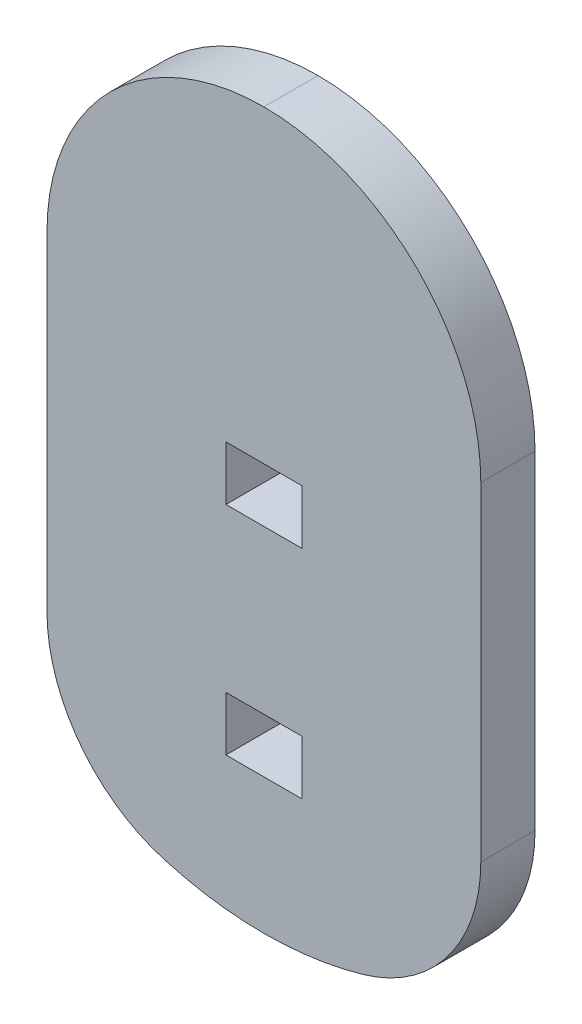
ISO-10303-21;
HEADER;
FILE_DESCRIPTION(('STEP AP214'),'2;1');
FILE_NAME('part.step','',(''),(''),'','','');
FILE_SCHEMA(('AUTOMOTIVE_DESIGN { 1 0 10303 214 1 1 1 1 }'));
ENDSEC;
DATA;
#1=APPLICATION_CONTEXT('core data for automotive mechanical design processes');
#2=APPLICATION_PROTOCOL_DEFINITION('international standard','automotive_design',2000,#1);
#3=PRODUCT_CONTEXT('',#1,'mechanical');
#4=PRODUCT('Part','Part','',(#3));
#5=PRODUCT_RELATED_PRODUCT_CATEGORY('part','',(#4));
#6=PRODUCT_DEFINITION_FORMATION('','',#4);
#7=PRODUCT_DEFINITION_CONTEXT('part definition',#1,'design');
#8=PRODUCT_DEFINITION('design','',#6,#7);
#9=PRODUCT_DEFINITION_SHAPE('','',#8);
#10=(LENGTH_UNIT() NAMED_UNIT(*) SI_UNIT(.MILLI.,.METRE.));
#11=(NAMED_UNIT(*) PLANE_ANGLE_UNIT() SI_UNIT($,.RADIAN.));
#12=(NAMED_UNIT(*) SI_UNIT($,.STERADIAN.) SOLID_ANGLE_UNIT());
#13=UNCERTAINTY_MEASURE_WITH_UNIT(LENGTH_MEASURE(1.E-05),#10,'distance_accuracy_value','');
#14=(GEOMETRIC_REPRESENTATION_CONTEXT(3) GLOBAL_UNCERTAINTY_ASSIGNED_CONTEXT((#13)) GLOBAL_UNIT_ASSIGNED_CONTEXT((#10,
#11,#12)) REPRESENTATION_CONTEXT('',''));
#15=CARTESIAN_POINT('',(0.,0.,0.));
#16=DIRECTION('',(0.,0.,1.));
#17=DIRECTION('',(1.,0.,0.));
#18=AXIS2_PLACEMENT_3D('',#15,#16,#17);
#19=CARTESIAN_POINT('',(0.,0.,5.));
#20=DIRECTION('',(0.,0.,-1.));
#21=DIRECTION('',(-1.,0.,0.));
#22=AXIS2_PLACEMENT_3D('',#19,#20,#21);
#23=CYLINDRICAL_SURFACE('',#22,33.);
#24=CARTESIAN_POINT('',(0.,0.,0.));
#25=DIRECTION('',(0.,0.,1.));
#26=DIRECTION('',(1.,0.,0.));
#27=AXIS2_PLACEMENT_3D('',#24,#25,#26);
#28=CIRCLE('',#27,33.);
#29=CARTESIAN_POINT('',(-9.16666666666666,-31.7012968539494,0.));
#30=VERTEX_POINT('',#29);
#31=CARTESIAN_POINT('',(9.16666666666668,-31.7012968539494,0.));
#32=VERTEX_POINT('',#31);
#33=EDGE_CURVE('E195',#30,#32,#28,.T.);
#34=ORIENTED_EDGE('',*,*,#33,.T.);
#35=DIRECTION('',(0.,0.,-1.));
#36=VECTOR('',#35,1.);
#37=CARTESIAN_POINT('',(9.16666666666668,-31.7012968539494,5.));
#38=LINE('',#37,#36);
#39=CARTESIAN_POINT('',(9.16666666666668,-31.7012968539494,5.));
#40=VERTEX_POINT('',#39);
#41=EDGE_CURVE('E227',#32,#40,#38,.F.);
#42=ORIENTED_EDGE('',*,*,#41,.T.);
#43=CARTESIAN_POINT('',(0.,0.,5.));
#44=DIRECTION('',(0.,0.,1.));
#45=DIRECTION('',(1.,0.,0.));
#46=AXIS2_PLACEMENT_3D('',#43,#44,#45);
#47=CIRCLE('',#46,33.);
#48=CARTESIAN_POINT('',(-9.16666666666666,-31.7012968539494,5.));
#49=VERTEX_POINT('',#48);
#50=EDGE_CURVE('E199',#49,#40,#47,.T.);
#51=ORIENTED_EDGE('',*,*,#50,.F.);
#52=DIRECTION('',(0.,0.,-1.));
#53=VECTOR('',#52,1.);
#54=CARTESIAN_POINT('',(-9.16666666666666,-31.7012968539494,5.));
#55=LINE('',#54,#53);
#56=EDGE_CURVE('E223',#49,#30,#55,.T.);
#57=ORIENTED_EDGE('',*,*,#56,.T.);
#58=EDGE_LOOP('',(#34,#42,#51,#57));
#59=FACE_BOUND('',#58,.T.);
#60=ADVANCED_FACE('F34',(#59),#23,.T.);
#61=CARTESIAN_POINT('',(0.,0.,5.));
#62=DIRECTION('',(0.,0.,1.));
#63=DIRECTION('',(1.,0.,0.));
#64=AXIS2_PLACEMENT_3D('',#61,#62,#63);
#65=PLANE('',#64);
#66=DIRECTION('',(0.,-1.,0.));
#67=VECTOR('',#66,1.);
#68=CARTESIAN_POINT('',(-3.5,4.5,5.));
#69=LINE('',#68,#67);
#70=CARTESIAN_POINT('',(-3.5,4.5,5.));
#71=VERTEX_POINT('',#70);
#72=CARTESIAN_POINT('',(-3.5,-0.5,5.));
#73=VERTEX_POINT('',#72);
#74=EDGE_CURVE('E49',#71,#73,#69,.T.);
#75=ORIENTED_EDGE('',*,*,#74,.F.);
#76=DIRECTION('',(-1.,0.,0.));
#77=VECTOR('',#76,1.);
#78=CARTESIAN_POINT('',(-3.5,4.5,5.));
#79=LINE('',#78,#77);
#80=CARTESIAN_POINT('',(3.5,4.5,5.));
#81=VERTEX_POINT('',#80);
#82=EDGE_CURVE('E165',#81,#71,#79,.T.);
#83=ORIENTED_EDGE('',*,*,#82,.F.);
#84=DIRECTION('',(0.,1.,0.));
#85=VECTOR('',#84,1.);
#86=CARTESIAN_POINT('',(3.5,4.5,5.));
#87=LINE('',#86,#85);
#88=CARTESIAN_POINT('',(3.5,-0.5,5.));
#89=VERTEX_POINT('',#88);
#90=EDGE_CURVE('E148',#89,#81,#87,.T.);
#91=ORIENTED_EDGE('',*,*,#90,.F.);
#92=DIRECTION('',(1.,0.,0.));
#93=VECTOR('',#92,1.);
#94=CARTESIAN_POINT('',(-3.5,-0.5,5.));
#95=LINE('',#94,#93);
#96=EDGE_CURVE('E158',#73,#89,#95,.T.);
#97=ORIENTED_EDGE('',*,*,#96,.F.);
#98=EDGE_LOOP('',(#75,#83,#91,#97));
#99=FACE_BOUND('',#98,.T.);
#100=DIRECTION('',(0.,-1.,0.));
#101=VECTOR('',#100,1.);
#102=CARTESIAN_POINT('',(-3.5,-15.5,5.));
#103=LINE('',#102,#101);
#104=CARTESIAN_POINT('',(-3.5,-15.5,5.));
#105=VERTEX_POINT('',#104);
#106=CARTESIAN_POINT('',(-3.5,-20.5,5.));
#107=VERTEX_POINT('',#106);
#108=EDGE_CURVE('E57',#105,#107,#103,.T.);
#109=ORIENTED_EDGE('',*,*,#108,.F.);
#110=DIRECTION('',(-1.,0.,0.));
#111=VECTOR('',#110,1.);
#112=CARTESIAN_POINT('',(-3.5,-15.5,5.));
#113=LINE('',#112,#111);
#114=CARTESIAN_POINT('',(3.5,-15.5,5.));
#115=VERTEX_POINT('',#114);
#116=EDGE_CURVE('E182',#115,#105,#113,.T.);
#117=ORIENTED_EDGE('',*,*,#116,.F.);
#118=DIRECTION('',(0.,1.,0.));
#119=VECTOR('',#118,1.);
#120=CARTESIAN_POINT('',(3.5,-15.5,5.));
#121=LINE('',#120,#119);
#122=CARTESIAN_POINT('',(3.5,-20.5,5.));
#123=VERTEX_POINT('',#122);
#124=EDGE_CURVE('E179',#123,#115,#121,.T.);
#125=ORIENTED_EDGE('',*,*,#124,.F.);
#126=DIRECTION('',(1.,0.,0.));
#127=VECTOR('',#126,1.);
#128=CARTESIAN_POINT('',(-3.5,-20.5,5.));
#129=LINE('',#128,#127);
#130=EDGE_CURVE('E176',#107,#123,#129,.T.);
#131=ORIENTED_EDGE('',*,*,#130,.F.);
#132=EDGE_LOOP('',(#109,#117,#125,#131));
#133=FACE_BOUND('',#132,.T.);
#134=ORIENTED_EDGE('',*,*,#50,.T.);
#135=CARTESIAN_POINT('',(5.00000000000001,-17.2916164657906,5.));
#136=DIRECTION('',(0.,0.,1.));
#137=DIRECTION('',(1.,0.,0.));
#138=AXIS2_PLACEMENT_3D('',#135,#136,#137);
#139=CIRCLE('',#138,15.);
#140=CARTESIAN_POINT('',(20.,-17.2916164657906,5.));
#141=VERTEX_POINT('',#140);
#142=EDGE_CURVE('E232',#40,#141,#139,.T.);
#143=ORIENTED_EDGE('',*,*,#142,.T.);
#144=DIRECTION('',(0.,-1.,0.));
#145=VECTOR('',#144,1.);
#146=CARTESIAN_POINT('',(20.,26.2488094968134,5.));
#147=LINE('',#146,#145);
#148=CARTESIAN_POINT('',(20.,13.,5.));
#149=VERTEX_POINT('',#148);
#150=EDGE_CURVE('E196',#149,#141,#147,.T.);
#151=ORIENTED_EDGE('',*,*,#150,.F.);
#152=CARTESIAN_POINT('',(0.,13.,5.));
#153=DIRECTION('',(0.,0.,1.));
#154=DIRECTION('',(1.,0.,0.));
#155=AXIS2_PLACEMENT_3D('',#152,#153,#154);
#156=CIRCLE('',#155,20.);
#157=CARTESIAN_POINT('',(0.,33.,5.));
#158=VERTEX_POINT('',#157);
#159=EDGE_CURVE('E209',#149,#158,#156,.T.);
#160=ORIENTED_EDGE('',*,*,#159,.T.);
#161=CARTESIAN_POINT('',(0.,13.,5.));
#162=DIRECTION('',(0.,0.,1.));
#163=DIRECTION('',(1.,0.,0.));
#164=AXIS2_PLACEMENT_3D('',#161,#162,#163);
#165=CIRCLE('',#164,20.);
#166=CARTESIAN_POINT('',(-20.,13.,5.));
#167=VERTEX_POINT('',#166);
#168=EDGE_CURVE('E211',#158,#167,#165,.T.);
#169=ORIENTED_EDGE('',*,*,#168,.T.);
#170=DIRECTION('',(0.,1.,0.));
#171=VECTOR('',#170,1.);
#172=CARTESIAN_POINT('',(-20.,26.2488094968134,5.));
#173=LINE('',#172,#171);
#174=CARTESIAN_POINT('',(-20.,-17.2916164657906,5.));
#175=VERTEX_POINT('',#174);
#176=EDGE_CURVE('E193',#175,#167,#173,.T.);
#177=ORIENTED_EDGE('',*,*,#176,.F.);
#178=CARTESIAN_POINT('',(-5.,-17.2916164657906,5.));
#179=DIRECTION('',(0.,0.,1.));
#180=DIRECTION('',(1.,0.,0.));
#181=AXIS2_PLACEMENT_3D('',#178,#179,#180);
#182=CIRCLE('',#181,15.);
#183=EDGE_CURVE('E230',#175,#49,#182,.T.);
#184=ORIENTED_EDGE('',*,*,#183,.T.);
#185=EDGE_LOOP('',(#134,#143,#151,#160,#169,#177,#184));
#186=FACE_BOUND('',#185,.T.);
#187=ADVANCED_FACE('F162',(#99,#133,#186),#65,.T.);
#188=CARTESIAN_POINT('',(0.,0.,0.));
#189=DIRECTION('',(0.,0.,1.));
#190=DIRECTION('',(1.,0.,0.));
#191=AXIS2_PLACEMENT_3D('',#188,#189,#190);
#192=PLANE('',#191);
#193=DIRECTION('',(-1.,0.,0.));
#194=VECTOR('',#193,1.);
#195=CARTESIAN_POINT('',(0.,4.5,0.));
#196=LINE('',#195,#194);
#197=CARTESIAN_POINT('',(3.5,4.5,0.));
#198=VERTEX_POINT('',#197);
#199=CARTESIAN_POINT('',(-3.5,4.5,0.));
#200=VERTEX_POINT('',#199);
#201=EDGE_CURVE('E42',#198,#200,#196,.T.);
#202=ORIENTED_EDGE('',*,*,#201,.T.);
#203=DIRECTION('',(0.,-1.,0.));
#204=VECTOR('',#203,1.);
#205=CARTESIAN_POINT('',(-3.5,0.,0.));
#206=LINE('',#205,#204);
#207=CARTESIAN_POINT('',(-3.5,-0.5,0.));
#208=VERTEX_POINT('',#207);
#209=EDGE_CURVE('E11',#200,#208,#206,.T.);
#210=ORIENTED_EDGE('',*,*,#209,.T.);
#211=DIRECTION('',(1.,0.,0.));
#212=VECTOR('',#211,1.);
#213=CARTESIAN_POINT('',(0.,-0.5,0.));
#214=LINE('',#213,#212);
#215=CARTESIAN_POINT('',(3.5,-0.5,0.));
#216=VERTEX_POINT('',#215);
#217=EDGE_CURVE('E255',#208,#216,#214,.T.);
#218=ORIENTED_EDGE('',*,*,#217,.T.);
#219=DIRECTION('',(0.,1.,0.));
#220=VECTOR('',#219,1.);
#221=CARTESIAN_POINT('',(3.5,0.,0.));
#222=LINE('',#221,#220);
#223=EDGE_CURVE('E151',#216,#198,#222,.T.);
#224=ORIENTED_EDGE('',*,*,#223,.T.);
#225=EDGE_LOOP('',(#202,#210,#218,#224));
#226=FACE_BOUND('',#225,.T.);
#227=DIRECTION('',(-1.,0.,0.));
#228=VECTOR('',#227,1.);
#229=CARTESIAN_POINT('',(0.,-15.5,0.));
#230=LINE('',#229,#228);
#231=CARTESIAN_POINT('',(3.5,-15.5,0.));
#232=VERTEX_POINT('',#231);
#233=CARTESIAN_POINT('',(-3.5,-15.5,0.));
#234=VERTEX_POINT('',#233);
#235=EDGE_CURVE('E249',#232,#234,#230,.T.);
#236=ORIENTED_EDGE('',*,*,#235,.T.);
#237=DIRECTION('',(0.,-1.,0.));
#238=VECTOR('',#237,1.);
#239=CARTESIAN_POINT('',(-3.5,0.,0.));
#240=LINE('',#239,#238);
#241=CARTESIAN_POINT('',(-3.5,-20.5,0.));
#242=VERTEX_POINT('',#241);
#243=EDGE_CURVE('E252',#234,#242,#240,.T.);
#244=ORIENTED_EDGE('',*,*,#243,.T.);
#245=DIRECTION('',(1.,0.,0.));
#246=VECTOR('',#245,1.);
#247=CARTESIAN_POINT('',(0.,-20.5,0.));
#248=LINE('',#247,#246);
#249=CARTESIAN_POINT('',(3.5,-20.5,0.));
#250=VERTEX_POINT('',#249);
#251=EDGE_CURVE('E243',#242,#250,#248,.T.);
#252=ORIENTED_EDGE('',*,*,#251,.T.);
#253=DIRECTION('',(0.,1.,0.));
#254=VECTOR('',#253,1.);
#255=CARTESIAN_POINT('',(3.5,0.,0.));
#256=LINE('',#255,#254);
#257=EDGE_CURVE('E246',#250,#232,#256,.T.);
#258=ORIENTED_EDGE('',*,*,#257,.T.);
#259=EDGE_LOOP('',(#236,#244,#252,#258));
#260=FACE_BOUND('',#259,.T.);
#261=DIRECTION('',(0.,-1.,0.));
#262=VECTOR('',#261,1.);
#263=CARTESIAN_POINT('',(20.,0.,0.));
#264=LINE('',#263,#262);
#265=CARTESIAN_POINT('',(20.,13.,0.));
#266=VERTEX_POINT('',#265);
#267=CARTESIAN_POINT('',(20.,-17.2916164657906,0.));
#268=VERTEX_POINT('',#267);
#269=EDGE_CURVE('E202',#266,#268,#264,.T.);
#270=ORIENTED_EDGE('',*,*,#269,.T.);
#271=CARTESIAN_POINT('',(5.00000000000001,-17.2916164657906,0.));
#272=DIRECTION('',(0.,0.,1.));
#273=DIRECTION('',(1.,0.,0.));
#274=AXIS2_PLACEMENT_3D('',#271,#272,#273);
#275=CIRCLE('',#274,15.);
#276=EDGE_CURVE('E238',#268,#32,#275,.F.);
#277=ORIENTED_EDGE('',*,*,#276,.T.);
#278=ORIENTED_EDGE('',*,*,#33,.F.);
#279=CARTESIAN_POINT('',(-5.,-17.2916164657906,0.));
#280=DIRECTION('',(0.,0.,1.));
#281=DIRECTION('',(1.,0.,0.));
#282=AXIS2_PLACEMENT_3D('',#279,#280,#281);
#283=CIRCLE('',#282,15.);
#284=CARTESIAN_POINT('',(-20.,-17.2916164657906,0.));
#285=VERTEX_POINT('',#284);
#286=EDGE_CURVE('E236',#30,#285,#283,.F.);
#287=ORIENTED_EDGE('',*,*,#286,.T.);
#288=DIRECTION('',(0.,1.,0.));
#289=VECTOR('',#288,1.);
#290=CARTESIAN_POINT('',(-20.,0.,0.));
#291=LINE('',#290,#289);
#292=CARTESIAN_POINT('',(-20.,13.,0.));
#293=VERTEX_POINT('',#292);
#294=EDGE_CURVE('E207',#285,#293,#291,.T.);
#295=ORIENTED_EDGE('',*,*,#294,.T.);
#296=CARTESIAN_POINT('',(0.,13.,0.));
#297=DIRECTION('',(0.,0.,1.));
#298=DIRECTION('',(1.,0.,0.));
#299=AXIS2_PLACEMENT_3D('',#296,#297,#298);
#300=CIRCLE('',#299,20.);
#301=CARTESIAN_POINT('',(0.,33.,0.));
#302=VERTEX_POINT('',#301);
#303=EDGE_CURVE('E219',#293,#302,#300,.F.);
#304=ORIENTED_EDGE('',*,*,#303,.T.);
#305=CARTESIAN_POINT('',(0.,13.,0.));
#306=DIRECTION('',(0.,0.,1.));
#307=DIRECTION('',(1.,0.,0.));
#308=AXIS2_PLACEMENT_3D('',#305,#306,#307);
#309=CIRCLE('',#308,20.);
#310=EDGE_CURVE('E217',#302,#266,#309,.F.);
#311=ORIENTED_EDGE('',*,*,#310,.T.);
#312=EDGE_LOOP('',(#270,#277,#278,#287,#295,#304,#311));
#313=FACE_BOUND('',#312,.T.);
#314=ADVANCED_FACE('F259',(#226,#260,#313),#192,.F.);
#315=CARTESIAN_POINT('',(20.,26.2488094968134,-5.));
#316=DIRECTION('',(-1.,0.,0.));
#317=DIRECTION('',(0.,0.,1.));
#318=AXIS2_PLACEMENT_3D('',#315,#316,#317);
#319=PLANE('',#318);
#320=ORIENTED_EDGE('',*,*,#150,.T.);
#321=DIRECTION('',(0.,0.,-1.));
#322=VECTOR('',#321,1.);
#323=CARTESIAN_POINT('',(20.,-17.2916164657906,-5.));
#324=LINE('',#323,#322);
#325=EDGE_CURVE('E234',#141,#268,#324,.T.);
#326=ORIENTED_EDGE('',*,*,#325,.T.);
#327=ORIENTED_EDGE('',*,*,#269,.F.);
#328=DIRECTION('',(0.,0.,-1.));
#329=VECTOR('',#328,1.);
#330=CARTESIAN_POINT('',(20.,13.,-5.));
#331=LINE('',#330,#329);
#332=EDGE_CURVE('E221',#266,#149,#331,.F.);
#333=ORIENTED_EDGE('',*,*,#332,.T.);
#334=EDGE_LOOP('',(#320,#326,#327,#333));
#335=FACE_BOUND('',#334,.T.);
#336=ADVANCED_FACE('F325',(#335),#319,.F.);
#337=CARTESIAN_POINT('',(-20.,26.2488094968134,-5.));
#338=DIRECTION('',(1.,0.,0.));
#339=DIRECTION('',(0.,0.,-1.));
#340=AXIS2_PLACEMENT_3D('',#337,#338,#339);
#341=PLANE('',#340);
#342=ORIENTED_EDGE('',*,*,#294,.F.);
#343=DIRECTION('',(0.,0.,-1.));
#344=VECTOR('',#343,1.);
#345=CARTESIAN_POINT('',(-20.,-17.2916164657906,-5.));
#346=LINE('',#345,#344);
#347=EDGE_CURVE('E240',#285,#175,#346,.F.);
#348=ORIENTED_EDGE('',*,*,#347,.T.);
#349=ORIENTED_EDGE('',*,*,#176,.T.);
#350=DIRECTION('',(0.,0.,-1.));
#351=VECTOR('',#350,1.);
#352=CARTESIAN_POINT('',(-20.,13.,-5.));
#353=LINE('',#352,#351);
#354=EDGE_CURVE('E214',#167,#293,#353,.T.);
#355=ORIENTED_EDGE('',*,*,#354,.T.);
#356=EDGE_LOOP('',(#342,#348,#349,#355));
#357=FACE_BOUND('',#356,.T.);
#358=ADVANCED_FACE('F294',(#357),#341,.F.);
#359=CARTESIAN_POINT('',(0.,13.,5.));
#360=DIRECTION('',(0.,0.,-1.));
#361=DIRECTION('',(-1.,0.,0.));
#362=AXIS2_PLACEMENT_3D('',#359,#360,#361);
#363=CYLINDRICAL_SURFACE('',#362,20.);
#364=ORIENTED_EDGE('',*,*,#332,.F.);
#365=ORIENTED_EDGE('',*,*,#310,.F.);
#366=DIRECTION('',(0.,0.,-1.));
#367=VECTOR('',#366,1.);
#368=CARTESIAN_POINT('',(0.,33.,5.));
#369=LINE('',#368,#367);
#370=EDGE_CURVE('E172',#158,#302,#369,.T.);
#371=ORIENTED_EDGE('',*,*,#370,.F.);
#372=ORIENTED_EDGE('',*,*,#159,.F.);
#373=EDGE_LOOP('',(#364,#365,#371,#372));
#374=FACE_BOUND('',#373,.T.);
#375=ADVANCED_FACE('F291',(#374),#363,.T.);
#376=CARTESIAN_POINT('',(0.,13.,5.));
#377=DIRECTION('',(0.,0.,-1.));
#378=DIRECTION('',(-1.,0.,0.));
#379=AXIS2_PLACEMENT_3D('',#376,#377,#378);
#380=CYLINDRICAL_SURFACE('',#379,20.);
#381=ORIENTED_EDGE('',*,*,#303,.F.);
#382=ORIENTED_EDGE('',*,*,#354,.F.);
#383=ORIENTED_EDGE('',*,*,#168,.F.);
#384=ORIENTED_EDGE('',*,*,#370,.T.);
#385=EDGE_LOOP('',(#381,#382,#383,#384));
#386=FACE_BOUND('',#385,.T.);
#387=ADVANCED_FACE('F287',(#386),#380,.T.);
#388=CARTESIAN_POINT('',(5.00000000000001,-17.2916164657906,5.));
#389=DIRECTION('',(0.,0.,-1.));
#390=DIRECTION('',(-1.,0.,0.));
#391=AXIS2_PLACEMENT_3D('',#388,#389,#390);
#392=CYLINDRICAL_SURFACE('',#391,15.);
#393=ORIENTED_EDGE('',*,*,#276,.F.);
#394=ORIENTED_EDGE('',*,*,#325,.F.);
#395=ORIENTED_EDGE('',*,*,#142,.F.);
#396=ORIENTED_EDGE('',*,*,#41,.F.);
#397=EDGE_LOOP('',(#393,#394,#395,#396));
#398=FACE_BOUND('',#397,.T.);
#399=ADVANCED_FACE('F290',(#398),#392,.T.);
#400=CARTESIAN_POINT('',(-5.,-17.2916164657906,5.));
#401=DIRECTION('',(0.,0.,-1.));
#402=DIRECTION('',(-1.,0.,0.));
#403=AXIS2_PLACEMENT_3D('',#400,#401,#402);
#404=CYLINDRICAL_SURFACE('',#403,15.);
#405=ORIENTED_EDGE('',*,*,#286,.F.);
#406=ORIENTED_EDGE('',*,*,#56,.F.);
#407=ORIENTED_EDGE('',*,*,#183,.F.);
#408=ORIENTED_EDGE('',*,*,#347,.F.);
#409=EDGE_LOOP('',(#405,#406,#407,#408));
#410=FACE_BOUND('',#409,.T.);
#411=ADVANCED_FACE('F36',(#410),#404,.T.);
#412=CARTESIAN_POINT('',(-3.5,-15.5,-5.));
#413=DIRECTION('',(-1.,0.,0.));
#414=DIRECTION('',(0.,-1.,0.));
#415=AXIS2_PLACEMENT_3D('',#412,#413,#414);
#416=PLANE('',#415);
#417=DIRECTION('',(0.,0.,1.));
#418=VECTOR('',#417,1.);
#419=CARTESIAN_POINT('',(-3.5,-15.5,-5.));
#420=LINE('',#419,#418);
#421=EDGE_CURVE('E186',#234,#105,#420,.T.);
#422=ORIENTED_EDGE('',*,*,#421,.T.);
#423=ORIENTED_EDGE('',*,*,#108,.T.);
#424=DIRECTION('',(0.,0.,1.));
#425=VECTOR('',#424,1.);
#426=CARTESIAN_POINT('',(-3.5,-20.5,-5.));
#427=LINE('',#426,#425);
#428=EDGE_CURVE('E185',#242,#107,#427,.T.);
#429=ORIENTED_EDGE('',*,*,#428,.F.);
#430=ORIENTED_EDGE('',*,*,#243,.F.);
#431=EDGE_LOOP('',(#422,#423,#429,#430));
#432=FACE_BOUND('',#431,.T.);
#433=ADVANCED_FACE('F301',(#432),#416,.F.);
#434=CARTESIAN_POINT('',(-3.5,-15.5,-5.));
#435=DIRECTION('',(0.,1.,0.));
#436=DIRECTION('',(0.,0.,1.));
#437=AXIS2_PLACEMENT_3D('',#434,#435,#436);
#438=PLANE('',#437);
#439=DIRECTION('',(0.,0.,1.));
#440=VECTOR('',#439,1.);
#441=CARTESIAN_POINT('',(3.5,-15.5,-5.));
#442=LINE('',#441,#440);
#443=EDGE_CURVE('E188',#232,#115,#442,.T.);
#444=ORIENTED_EDGE('',*,*,#443,.T.);
#445=ORIENTED_EDGE('',*,*,#116,.T.);
#446=ORIENTED_EDGE('',*,*,#421,.F.);
#447=ORIENTED_EDGE('',*,*,#235,.F.);
#448=EDGE_LOOP('',(#444,#445,#446,#447));
#449=FACE_BOUND('',#448,.T.);
#450=ADVANCED_FACE('F336',(#449),#438,.F.);
#451=CARTESIAN_POINT('',(3.5,-15.5,-5.));
#452=DIRECTION('',(1.,0.,0.));
#453=DIRECTION('',(0.,1.,0.));
#454=AXIS2_PLACEMENT_3D('',#451,#452,#453);
#455=PLANE('',#454);
#456=DIRECTION('',(0.,0.,1.));
#457=VECTOR('',#456,1.);
#458=CARTESIAN_POINT('',(3.5,-20.5,-5.));
#459=LINE('',#458,#457);
#460=EDGE_CURVE('E190',#250,#123,#459,.T.);
#461=ORIENTED_EDGE('',*,*,#460,.T.);
#462=ORIENTED_EDGE('',*,*,#124,.T.);
#463=ORIENTED_EDGE('',*,*,#443,.F.);
#464=ORIENTED_EDGE('',*,*,#257,.F.);
#465=EDGE_LOOP('',(#461,#462,#463,#464));
#466=FACE_BOUND('',#465,.T.);
#467=ADVANCED_FACE('F273',(#466),#455,.F.);
#468=CARTESIAN_POINT('',(-3.5,-20.5,-5.));
#469=DIRECTION('',(0.,-1.,0.));
#470=DIRECTION('',(0.,0.,-1.));
#471=AXIS2_PLACEMENT_3D('',#468,#469,#470);
#472=PLANE('',#471);
#473=ORIENTED_EDGE('',*,*,#428,.T.);
#474=ORIENTED_EDGE('',*,*,#130,.T.);
#475=ORIENTED_EDGE('',*,*,#460,.F.);
#476=ORIENTED_EDGE('',*,*,#251,.F.);
#477=EDGE_LOOP('',(#473,#474,#475,#476));
#478=FACE_BOUND('',#477,.T.);
#479=ADVANCED_FACE('F266',(#478),#472,.F.);
#480=CARTESIAN_POINT('',(-3.5,4.5,-5.));
#481=DIRECTION('',(-1.,0.,0.));
#482=DIRECTION('',(0.,0.,1.));
#483=AXIS2_PLACEMENT_3D('',#480,#481,#482);
#484=PLANE('',#483);
#485=DIRECTION('',(0.,0.,1.));
#486=VECTOR('',#485,1.);
#487=CARTESIAN_POINT('',(-3.5,4.5,-5.));
#488=LINE('',#487,#486);
#489=EDGE_CURVE('E170',#200,#71,#488,.T.);
#490=ORIENTED_EDGE('',*,*,#489,.T.);
#491=ORIENTED_EDGE('',*,*,#74,.T.);
#492=DIRECTION('',(0.,0.,1.));
#493=VECTOR('',#492,1.);
#494=CARTESIAN_POINT('',(-3.5,-0.5,-5.));
#495=LINE('',#494,#493);
#496=EDGE_CURVE('E155',#208,#73,#495,.T.);
#497=ORIENTED_EDGE('',*,*,#496,.F.);
#498=ORIENTED_EDGE('',*,*,#209,.F.);
#499=EDGE_LOOP('',(#490,#491,#497,#498));
#500=FACE_BOUND('',#499,.T.);
#501=ADVANCED_FACE('F264',(#500),#484,.F.);
#502=CARTESIAN_POINT('',(-3.5,4.5,-5.));
#503=DIRECTION('',(0.,1.,0.));
#504=DIRECTION('',(0.,0.,1.));
#505=AXIS2_PLACEMENT_3D('',#502,#503,#504);
#506=PLANE('',#505);
#507=DIRECTION('',(0.,0.,1.));
#508=VECTOR('',#507,1.);
#509=CARTESIAN_POINT('',(3.5,4.5,-5.));
#510=LINE('',#509,#508);
#511=EDGE_CURVE('E154',#198,#81,#510,.T.);
#512=ORIENTED_EDGE('',*,*,#511,.T.);
#513=ORIENTED_EDGE('',*,*,#82,.T.);
#514=ORIENTED_EDGE('',*,*,#489,.F.);
#515=ORIENTED_EDGE('',*,*,#201,.F.);
#516=EDGE_LOOP('',(#512,#513,#514,#515));
#517=FACE_BOUND('',#516,.T.);
#518=ADVANCED_FACE('F263',(#517),#506,.F.);
#519=CARTESIAN_POINT('',(3.5,4.5,-5.));
#520=DIRECTION('',(1.,0.,0.));
#521=DIRECTION('',(0.,0.,-1.));
#522=AXIS2_PLACEMENT_3D('',#519,#520,#521);
#523=PLANE('',#522);
#524=DIRECTION('',(0.,0.,1.));
#525=VECTOR('',#524,1.);
#526=CARTESIAN_POINT('',(3.5,-0.5,-5.));
#527=LINE('',#526,#525);
#528=EDGE_CURVE('E143',#216,#89,#527,.T.);
#529=ORIENTED_EDGE('',*,*,#528,.T.);
#530=ORIENTED_EDGE('',*,*,#90,.T.);
#531=ORIENTED_EDGE('',*,*,#511,.F.);
#532=ORIENTED_EDGE('',*,*,#223,.F.);
#533=EDGE_LOOP('',(#529,#530,#531,#532));
#534=FACE_BOUND('',#533,.T.);
#535=ADVANCED_FACE('F145',(#534),#523,.F.);
#536=CARTESIAN_POINT('',(-3.5,-0.5,-5.));
#537=DIRECTION('',(0.,-1.,0.));
#538=DIRECTION('',(0.,0.,-1.));
#539=AXIS2_PLACEMENT_3D('',#536,#537,#538);
#540=PLANE('',#539);
#541=ORIENTED_EDGE('',*,*,#496,.T.);
#542=ORIENTED_EDGE('',*,*,#96,.T.);
#543=ORIENTED_EDGE('',*,*,#528,.F.);
#544=ORIENTED_EDGE('',*,*,#217,.F.);
#545=EDGE_LOOP('',(#541,#542,#543,#544));
#546=FACE_BOUND('',#545,.T.);
#547=ADVANCED_FACE('F159',(#546),#540,.F.);
#548=CLOSED_SHELL('',(#60,#187,#314,#336,#358,#375,#387,#399,#411,#433,#450,#467,#479,#501,#518,
#535,#547));
#549=MANIFOLD_SOLID_BREP('B2',#548);
#550=ADVANCED_BREP_SHAPE_REPRESENTATION('',(#18,#549),#14);
#551=SHAPE_DEFINITION_REPRESENTATION(#9,#550);
ENDSEC;
END-ISO-10303-21;
